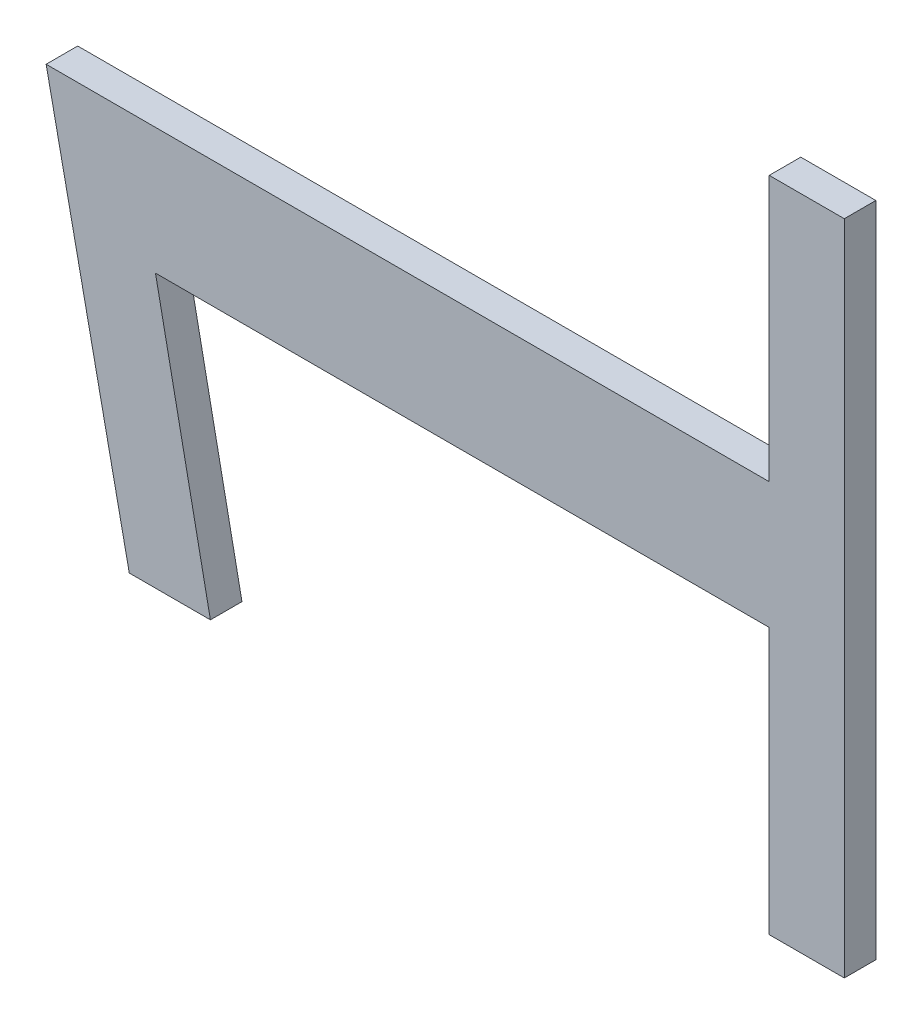
ISO-10303-21;
HEADER;
FILE_DESCRIPTION(('STEP AP214'),'2;1');
FILE_NAME('part.step','',(''),(''),'','','');
FILE_SCHEMA(('AUTOMOTIVE_DESIGN { 1 0 10303 214 1 1 1 1 }'));
ENDSEC;
DATA;
#1=APPLICATION_CONTEXT('core data for automotive mechanical design processes');
#2=APPLICATION_PROTOCOL_DEFINITION('international standard','automotive_design',2000,#1);
#3=PRODUCT_CONTEXT('',#1,'mechanical');
#4=PRODUCT('Part','Part','',(#3));
#5=PRODUCT_RELATED_PRODUCT_CATEGORY('part','',(#4));
#6=PRODUCT_DEFINITION_FORMATION('','',#4);
#7=PRODUCT_DEFINITION_CONTEXT('part definition',#1,'design');
#8=PRODUCT_DEFINITION('design','',#6,#7);
#9=PRODUCT_DEFINITION_SHAPE('','',#8);
#10=(LENGTH_UNIT() NAMED_UNIT(*) SI_UNIT(.MILLI.,.METRE.));
#11=(NAMED_UNIT(*) PLANE_ANGLE_UNIT() SI_UNIT($,.RADIAN.));
#12=(NAMED_UNIT(*) SI_UNIT($,.STERADIAN.) SOLID_ANGLE_UNIT());
#13=UNCERTAINTY_MEASURE_WITH_UNIT(LENGTH_MEASURE(1.E-05),#10,'distance_accuracy_value','');
#14=(GEOMETRIC_REPRESENTATION_CONTEXT(3) GLOBAL_UNCERTAINTY_ASSIGNED_CONTEXT((#13)) GLOBAL_UNIT_ASSIGNED_CONTEXT((#10,
#11,#12)) REPRESENTATION_CONTEXT('',''));
#15=CARTESIAN_POINT('',(0.,0.,0.));
#16=DIRECTION('',(0.,0.,1.));
#17=DIRECTION('',(1.,0.,0.));
#18=AXIS2_PLACEMENT_3D('',#15,#16,#17);
#19=CARTESIAN_POINT('',(-8.95983005625009,-22.7704584365744,333.160489148867));
#20=DIRECTION('',(0.,0.,1.));
#21=DIRECTION('',(1.,0.,0.));
#22=AXIS2_PLACEMENT_3D('',#19,#20,#21);
#23=PLANE('',#22);
#24=DIRECTION('',(0.,-1.,0.));
#25=VECTOR('',#24,1.);
#26=CARTESIAN_POINT('',(-6.41452319026449,-50.9500000001419,333.160489148867));
#27=LINE('',#26,#25);
#28=CARTESIAN_POINT('',(-6.41452319026449,38.8358930212972,333.160489148867));
#29=VERTEX_POINT('',#28);
#30=CARTESIAN_POINT('',(-6.41452319026449,32.5863625224991,333.160489148867));
#31=VERTEX_POINT('',#30);
#32=EDGE_CURVE('E11',#29,#31,#27,.T.);
#33=ORIENTED_EDGE('',*,*,#32,.T.);
#34=DIRECTION('',(-1.,0.,0.));
#35=VECTOR('',#34,1.);
#36=CARTESIAN_POINT('',(2.66453525910038E-13,32.5863625224991,333.160489148867));
#37=LINE('',#36,#35);
#38=CARTESIAN_POINT('',(-7.12807111694718,32.5863625224991,333.160489148867));
#39=VERTEX_POINT('',#38);
#40=EDGE_CURVE('E246',#31,#39,#37,.T.);
#41=ORIENTED_EDGE('',*,*,#40,.T.);
#42=DIRECTION('',(0.,1.,0.));
#43=VECTOR('',#42,1.);
#44=CARTESIAN_POINT('',(-7.12807111694718,-50.9500000001419,333.160489148867));
#45=LINE('',#44,#43);
#46=CARTESIAN_POINT('',(-7.12807111694718,35.114908125426,333.160489148867));
#47=VERTEX_POINT('',#46);
#48=EDGE_CURVE('E172',#39,#47,#45,.T.);
#49=ORIENTED_EDGE('',*,*,#48,.T.);
#50=DIRECTION('',(-1.,0.,0.));
#51=VECTOR('',#50,1.);
#52=CARTESIAN_POINT('',(2.66453525910038E-13,35.114908125426,333.160489148867));
#53=LINE('',#52,#51);
#54=CARTESIAN_POINT('',(-12.9609662491587,35.114908125426,333.160489148867));
#55=VERTEX_POINT('',#54);
#56=EDGE_CURVE('E145',#47,#55,#53,.T.);
#57=ORIENTED_EDGE('',*,*,#56,.T.);
#58=DIRECTION('',(0.197334533034253,-0.98033620869177,0.));
#59=VECTOR('',#58,1.);
#60=CARTESIAN_POINT('',(4.1933625869925,-50.1059066772484,333.160489148867));
#61=LINE('',#60,#59);
#62=CARTESIAN_POINT('',(-12.4389748128606,32.5217122069943,333.160489148867));
#63=VERTEX_POINT('',#62);
#64=EDGE_CURVE('E154',#55,#63,#61,.T.);
#65=ORIENTED_EDGE('',*,*,#64,.T.);
#66=DIRECTION('',(-1.,0.,0.));
#67=VECTOR('',#66,1.);
#68=CARTESIAN_POINT('',(2.66453525910038E-13,32.5217122069943,333.160489148867));
#69=LINE('',#68,#67);
#70=CARTESIAN_POINT('',(-13.2099896866587,32.5217122069943,333.160489148867));
#71=VERTEX_POINT('',#70);
#72=EDGE_CURVE('E238',#63,#71,#69,.T.);
#73=ORIENTED_EDGE('',*,*,#72,.T.);
#74=DIRECTION('',(-0.203954250496693,0.978980420490794,0.));
#75=VECTOR('',#74,1.);
#76=CARTESIAN_POINT('',(4.00607524756107,-50.1154010056697,333.160489148867));
#77=LINE('',#76,#75);
#78=CARTESIAN_POINT('',(-14.0001602094953,36.3145307867598,333.160489148867));
#79=VERTEX_POINT('',#78);
#80=EDGE_CURVE('E237',#71,#79,#77,.T.);
#81=ORIENTED_EDGE('',*,*,#80,.T.);
#82=DIRECTION('',(1.,0.,0.));
#83=VECTOR('',#82,1.);
#84=CARTESIAN_POINT('',(2.66453525910038E-13,36.3145307867598,333.160489148867));
#85=LINE('',#84,#83);
#86=CARTESIAN_POINT('',(-7.12807111694718,36.3145307867598,333.160489148867));
#87=VERTEX_POINT('',#86);
#88=EDGE_CURVE('E264',#79,#87,#85,.T.);
#89=ORIENTED_EDGE('',*,*,#88,.T.);
#90=DIRECTION('',(0.,1.,0.));
#91=VECTOR('',#90,1.);
#92=CARTESIAN_POINT('',(-7.12807111694718,-50.9500000001419,333.160489148867));
#93=LINE('',#92,#91);
#94=CARTESIAN_POINT('',(-7.12807111694718,38.8358930212972,333.160489148867));
#95=VERTEX_POINT('',#94);
#96=EDGE_CURVE('E325',#87,#95,#93,.T.);
#97=ORIENTED_EDGE('',*,*,#96,.T.);
#98=DIRECTION('',(1.,0.,0.));
#99=VECTOR('',#98,1.);
#100=CARTESIAN_POINT('',(2.66453525910038E-13,38.8358930212972,333.160489148867));
#101=LINE('',#100,#99);
#102=EDGE_CURVE('E229',#95,#29,#101,.T.);
#103=ORIENTED_EDGE('',*,*,#102,.T.);
#104=EDGE_LOOP('',(#33,#41,#49,#57,#65,#73,#81,#89,#97,#103));
#105=FACE_BOUND('',#104,.T.);
#106=ADVANCED_FACE('F42',(#105),#23,.F.);
#107=CARTESIAN_POINT('',(-6.41452319026449,32.5863625224991,332.960489148867));
#108=DIRECTION('',(1.,0.,0.));
#109=DIRECTION('',(0.,1.,0.));
#110=AXIS2_PLACEMENT_3D('',#107,#108,#109);
#111=PLANE('',#110);
#112=ORIENTED_EDGE('',*,*,#32,.F.);
#113=CARTESIAN_POINT('',(-6.41452319026449,38.8358930212972,333.160489148867));
#114=CARTESIAN_POINT('',(-6.41452319026449,38.8358930212972,333.260489148867));
#115=CARTESIAN_POINT('',(-6.41452319026449,38.8358930212972,333.360489148867));
#116=CARTESIAN_POINT('',(-6.41452319026449,38.8358930212972,333.460489148867));
#117=(BOUNDED_CURVE() B_SPLINE_CURVE(3,(#113,#114,#115,#116),.UNSPECIFIED.,.F.,
.F.) B_SPLINE_CURVE_WITH_KNOTS((4,4),(0.,1.),
.UNSPECIFIED.) CURVE() GEOMETRIC_REPRESENTATION_ITEM() RATIONAL_B_SPLINE_CURVE((1.,1.,1.,1.)) REPRESENTATION_ITEM(''));
#118=CARTESIAN_POINT('',(-6.41452319026449,38.8358930212972,333.460489148867));
#119=VERTEX_POINT('',#118);
#120=EDGE_CURVE('E55',#29,#119,#117,.T.);
#121=ORIENTED_EDGE('',*,*,#120,.T.);
#122=CARTESIAN_POINT('',(-6.41452319026449,32.5863625224991,333.460489148867));
#123=CARTESIAN_POINT('',(-6.41452319026449,34.6695393554318,333.460489148867));
#124=CARTESIAN_POINT('',(-6.41452319026449,36.7527161883645,333.460489148867));
#125=CARTESIAN_POINT('',(-6.41452319026449,38.8358930212972,333.460489148867));
#126=(BOUNDED_CURVE() B_SPLINE_CURVE(3,(#122,#123,#124,#125),.UNSPECIFIED.,.F.,
.F.) B_SPLINE_CURVE_WITH_KNOTS((4,4),(0.,1.),
.UNSPECIFIED.) CURVE() GEOMETRIC_REPRESENTATION_ITEM() RATIONAL_B_SPLINE_CURVE((1.,1.,1.,1.)) REPRESENTATION_ITEM(''));
#127=CARTESIAN_POINT('',(-6.41452319026449,32.5863625224991,333.460489148867));
#128=VERTEX_POINT('',#127);
#129=EDGE_CURVE('E193',#128,#119,#126,.T.);
#130=ORIENTED_EDGE('',*,*,#129,.F.);
#131=CARTESIAN_POINT('',(-6.41452319026449,32.5863625224991,333.160489148867));
#132=CARTESIAN_POINT('',(-6.41452319026449,32.5863625224991,333.260489148867));
#133=CARTESIAN_POINT('',(-6.41452319026449,32.5863625224991,333.360489148867));
#134=CARTESIAN_POINT('',(-6.41452319026449,32.5863625224991,333.460489148867));
#135=(BOUNDED_CURVE() B_SPLINE_CURVE(3,(#131,#132,#133,#134),.UNSPECIFIED.,.F.,
.F.) B_SPLINE_CURVE_WITH_KNOTS((4,4),(0.,1.),
.UNSPECIFIED.) CURVE() GEOMETRIC_REPRESENTATION_ITEM() RATIONAL_B_SPLINE_CURVE((1.,1.,1.,1.)) REPRESENTATION_ITEM(''));
#136=EDGE_CURVE('E202',#31,#128,#135,.T.);
#137=ORIENTED_EDGE('',*,*,#136,.F.);
#138=EDGE_LOOP('',(#112,#121,#130,#137));
#139=FACE_BOUND('',#138,.T.);
#140=ADVANCED_FACE('F367',(#139),#111,.T.);
#141=CARTESIAN_POINT('',(-6.41452319026449,38.8358930212972,332.960489148867));
#142=DIRECTION('',(0.,1.,0.));
#143=DIRECTION('',(1.,0.,0.));
#144=AXIS2_PLACEMENT_3D('',#141,#142,#143);
#145=PLANE('',#144);
#146=ORIENTED_EDGE('',*,*,#102,.F.);
#147=CARTESIAN_POINT('',(-7.12807111694718,38.8358930212972,333.160489148867));
#148=CARTESIAN_POINT('',(-7.12807111694718,38.8358930212972,333.260489148867));
#149=CARTESIAN_POINT('',(-7.12807111694718,38.8358930212972,333.360489148867));
#150=CARTESIAN_POINT('',(-7.12807111694718,38.8358930212972,333.460489148867));
#151=(BOUNDED_CURVE() B_SPLINE_CURVE(3,(#147,#148,#149,#150),.UNSPECIFIED.,.F.,
.F.) B_SPLINE_CURVE_WITH_KNOTS((4,4),(0.,1.),
.UNSPECIFIED.) CURVE() GEOMETRIC_REPRESENTATION_ITEM() RATIONAL_B_SPLINE_CURVE((1.,1.,1.,1.)) REPRESENTATION_ITEM(''));
#152=CARTESIAN_POINT('',(-7.12807111694718,38.8358930212972,333.460489148867));
#153=VERTEX_POINT('',#152);
#154=EDGE_CURVE('E181',#95,#153,#151,.T.);
#155=ORIENTED_EDGE('',*,*,#154,.T.);
#156=CARTESIAN_POINT('',(-6.41452319026449,38.8358930212972,333.460489148867));
#157=CARTESIAN_POINT('',(-6.65237249915872,38.8358930212972,333.460489148867));
#158=CARTESIAN_POINT('',(-6.89022180805295,38.8358930212972,333.460489148867));
#159=CARTESIAN_POINT('',(-7.12807111694718,38.8358930212972,333.460489148867));
#160=(BOUNDED_CURVE() B_SPLINE_CURVE(3,(#156,#157,#158,#159),.UNSPECIFIED.,.F.,
.F.) B_SPLINE_CURVE_WITH_KNOTS((4,4),(0.,1.),
.UNSPECIFIED.) CURVE() GEOMETRIC_REPRESENTATION_ITEM() RATIONAL_B_SPLINE_CURVE((1.,1.,1.,1.)) REPRESENTATION_ITEM(''));
#161=EDGE_CURVE('E186',#119,#153,#160,.T.);
#162=ORIENTED_EDGE('',*,*,#161,.F.);
#163=ORIENTED_EDGE('',*,*,#120,.F.);
#164=EDGE_LOOP('',(#146,#155,#162,#163));
#165=FACE_BOUND('',#164,.T.);
#166=ADVANCED_FACE('F369',(#165),#145,.T.);
#167=CARTESIAN_POINT('',(-7.12807111694718,38.8358930212972,332.960489148867));
#168=DIRECTION('',(-1.,0.,0.));
#169=DIRECTION('',(0.,0.,1.));
#170=AXIS2_PLACEMENT_3D('',#167,#168,#169);
#171=PLANE('',#170);
#172=ORIENTED_EDGE('',*,*,#96,.F.);
#173=CARTESIAN_POINT('',(-7.12807111694718,36.3145307867598,333.160489148867));
#174=CARTESIAN_POINT('',(-7.12807111694718,36.3145307867598,333.260489148867));
#175=CARTESIAN_POINT('',(-7.12807111694718,36.3145307867598,333.360489148867));
#176=CARTESIAN_POINT('',(-7.12807111694718,36.3145307867598,333.460489148867));
#177=(BOUNDED_CURVE() B_SPLINE_CURVE(3,(#173,#174,#175,#176),.UNSPECIFIED.,.F.,
.F.) B_SPLINE_CURVE_WITH_KNOTS((4,4),(0.,1.),
.UNSPECIFIED.) CURVE() GEOMETRIC_REPRESENTATION_ITEM() RATIONAL_B_SPLINE_CURVE((1.,1.,1.,1.)) REPRESENTATION_ITEM(''));
#178=CARTESIAN_POINT('',(-7.12807111694718,36.3145307867598,333.460489148867));
#179=VERTEX_POINT('',#178);
#180=EDGE_CURVE('E268',#87,#179,#177,.T.);
#181=ORIENTED_EDGE('',*,*,#180,.T.);
#182=CARTESIAN_POINT('',(-7.12807111694718,38.8358930212972,333.460489148867));
#183=CARTESIAN_POINT('',(-7.12807111694718,37.995438943118,333.460489148867));
#184=CARTESIAN_POINT('',(-7.12807111694718,37.1549848649389,333.460489148867));
#185=CARTESIAN_POINT('',(-7.12807111694718,36.3145307867598,333.460489148867));
#186=(BOUNDED_CURVE() B_SPLINE_CURVE(3,(#182,#183,#184,#185),.UNSPECIFIED.,.F.,
.F.) B_SPLINE_CURVE_WITH_KNOTS((4,4),(0.,1.),
.UNSPECIFIED.) CURVE() GEOMETRIC_REPRESENTATION_ITEM() RATIONAL_B_SPLINE_CURVE((1.,1.,1.,1.)) REPRESENTATION_ITEM(''));
#187=EDGE_CURVE('E192',#153,#179,#186,.T.);
#188=ORIENTED_EDGE('',*,*,#187,.F.);
#189=ORIENTED_EDGE('',*,*,#154,.F.);
#190=EDGE_LOOP('',(#172,#181,#188,#189));
#191=FACE_BOUND('',#190,.T.);
#192=ADVANCED_FACE('F372',(#191),#171,.T.);
#193=CARTESIAN_POINT('',(-7.12807111694718,36.3145307867598,332.960489148867));
#194=DIRECTION('',(0.,1.,0.));
#195=DIRECTION('',(1.,0.,0.));
#196=AXIS2_PLACEMENT_3D('',#193,#194,#195);
#197=PLANE('',#196);
#198=ORIENTED_EDGE('',*,*,#88,.F.);
#199=CARTESIAN_POINT('',(-14.0001602094953,36.3145307867598,333.160489148867));
#200=CARTESIAN_POINT('',(-14.0001602094953,36.3145307867598,333.260489148867));
#201=CARTESIAN_POINT('',(-14.0001602094953,36.3145307867598,333.360489148867));
#202=CARTESIAN_POINT('',(-14.0001602094953,36.3145307867598,333.460489148867));
#203=(BOUNDED_CURVE() B_SPLINE_CURVE(3,(#199,#200,#201,#202),.UNSPECIFIED.,.F.,
.F.) B_SPLINE_CURVE_WITH_KNOTS((4,4),(0.,1.),
.UNSPECIFIED.) CURVE() GEOMETRIC_REPRESENTATION_ITEM() RATIONAL_B_SPLINE_CURVE((1.,1.,1.,1.)) REPRESENTATION_ITEM(''));
#204=CARTESIAN_POINT('',(-14.0001602094953,36.3145307867598,333.460489148867));
#205=VERTEX_POINT('',#204);
#206=EDGE_CURVE('E46',#79,#205,#203,.T.);
#207=ORIENTED_EDGE('',*,*,#206,.T.);
#208=CARTESIAN_POINT('',(-7.12807111694718,36.3145307867598,333.460489148867));
#209=CARTESIAN_POINT('',(-9.41876748112988,36.3145307867598,333.460489148867));
#210=CARTESIAN_POINT('',(-11.7094638453126,36.3145307867598,333.460489148867));
#211=CARTESIAN_POINT('',(-14.0001602094953,36.3145307867598,333.460489148867));
#212=(BOUNDED_CURVE() B_SPLINE_CURVE(3,(#208,#209,#210,#211),.UNSPECIFIED.,.F.,
.F.) B_SPLINE_CURVE_WITH_KNOTS((4,4),(0.,1.),
.UNSPECIFIED.) CURVE() GEOMETRIC_REPRESENTATION_ITEM() RATIONAL_B_SPLINE_CURVE((1.,1.,1.,1.)) REPRESENTATION_ITEM(''));
#213=EDGE_CURVE('E247',#179,#205,#212,.T.);
#214=ORIENTED_EDGE('',*,*,#213,.F.);
#215=ORIENTED_EDGE('',*,*,#180,.F.);
#216=EDGE_LOOP('',(#198,#207,#214,#215));
#217=FACE_BOUND('',#216,.T.);
#218=ADVANCED_FACE('F374',(#217),#197,.T.);
#219=CARTESIAN_POINT('',(-14.0001602094953,36.3145307867598,332.960489148867));
#220=DIRECTION('',(-0.978980420490794,-0.203954250496693,0.));
#221=DIRECTION('',(-0.203954250496693,0.978980420490794,0.));
#222=AXIS2_PLACEMENT_3D('',#219,#220,#221);
#223=PLANE('',#222);
#224=ORIENTED_EDGE('',*,*,#80,.F.);
#225=CARTESIAN_POINT('',(-13.2099896866587,32.5217122069943,333.160489148867));
#226=CARTESIAN_POINT('',(-13.2099896866587,32.5217122069943,333.260489148867));
#227=CARTESIAN_POINT('',(-13.2099896866587,32.5217122069943,333.360489148867));
#228=CARTESIAN_POINT('',(-13.2099896866587,32.5217122069943,333.460489148867));
#229=(BOUNDED_CURVE() B_SPLINE_CURVE(3,(#225,#226,#227,#228),.UNSPECIFIED.,.F.,
.F.) B_SPLINE_CURVE_WITH_KNOTS((4,4),(0.,1.),
.UNSPECIFIED.) CURVE() GEOMETRIC_REPRESENTATION_ITEM() RATIONAL_B_SPLINE_CURVE((1.,1.,1.,1.)) REPRESENTATION_ITEM(''));
#230=CARTESIAN_POINT('',(-13.2099896866587,32.5217122069943,333.460489148867));
#231=VERTEX_POINT('',#230);
#232=EDGE_CURVE('E122',#71,#231,#229,.T.);
#233=ORIENTED_EDGE('',*,*,#232,.T.);
#234=CARTESIAN_POINT('',(-14.0001602094953,36.3145307867598,333.460489148867));
#235=CARTESIAN_POINT('',(-13.7367700352164,35.050257926838,333.460489148867));
#236=CARTESIAN_POINT('',(-13.4733798609376,33.7859850669161,333.460489148867));
#237=CARTESIAN_POINT('',(-13.2099896866587,32.5217122069943,333.460489148867));
#238=(BOUNDED_CURVE() B_SPLINE_CURVE(3,(#234,#235,#236,#237),.UNSPECIFIED.,.F.,
.F.) B_SPLINE_CURVE_WITH_KNOTS((4,4),(0.,1.),
.UNSPECIFIED.) CURVE() GEOMETRIC_REPRESENTATION_ITEM() RATIONAL_B_SPLINE_CURVE((1.,1.,1.,1.)) REPRESENTATION_ITEM(''));
#239=EDGE_CURVE('E256',#205,#231,#238,.T.);
#240=ORIENTED_EDGE('',*,*,#239,.F.);
#241=ORIENTED_EDGE('',*,*,#206,.F.);
#242=EDGE_LOOP('',(#224,#233,#240,#241));
#243=FACE_BOUND('',#242,.T.);
#244=ADVANCED_FACE('F376',(#243),#223,.T.);
#245=CARTESIAN_POINT('',(-13.2099896866587,32.5217122069943,332.960489148867));
#246=DIRECTION('',(0.,-1.,0.));
#247=DIRECTION('',(0.,0.,-1.));
#248=AXIS2_PLACEMENT_3D('',#245,#246,#247);
#249=PLANE('',#248);
#250=ORIENTED_EDGE('',*,*,#72,.F.);
#251=CARTESIAN_POINT('',(-12.4389748128606,32.5217122069943,333.160489148867));
#252=CARTESIAN_POINT('',(-12.4389748128606,32.5217122069943,333.260489148867));
#253=CARTESIAN_POINT('',(-12.4389748128606,32.5217122069943,333.360489148867));
#254=CARTESIAN_POINT('',(-12.4389748128606,32.5217122069943,333.460489148867));
#255=(BOUNDED_CURVE() B_SPLINE_CURVE(3,(#251,#252,#253,#254),.UNSPECIFIED.,.F.,
.F.) B_SPLINE_CURVE_WITH_KNOTS((4,4),(0.,1.),
.UNSPECIFIED.) CURVE() GEOMETRIC_REPRESENTATION_ITEM() RATIONAL_B_SPLINE_CURVE((1.,1.,1.,1.)) REPRESENTATION_ITEM(''));
#256=CARTESIAN_POINT('',(-12.4389748128606,32.5217122069943,333.460489148867));
#257=VERTEX_POINT('',#256);
#258=EDGE_CURVE('E159',#63,#257,#255,.T.);
#259=ORIENTED_EDGE('',*,*,#258,.T.);
#260=CARTESIAN_POINT('',(-13.2099896866587,32.5217122069943,333.460489148867));
#261=CARTESIAN_POINT('',(-12.952984728726,32.5217122069943,333.460489148867));
#262=CARTESIAN_POINT('',(-12.6959797707933,32.5217122069943,333.460489148867));
#263=CARTESIAN_POINT('',(-12.4389748128606,32.5217122069943,333.460489148867));
#264=(BOUNDED_CURVE() B_SPLINE_CURVE(3,(#260,#261,#262,#263),.UNSPECIFIED.,.F.,
.F.) B_SPLINE_CURVE_WITH_KNOTS((4,4),(0.,1.),
.UNSPECIFIED.) CURVE() GEOMETRIC_REPRESENTATION_ITEM() RATIONAL_B_SPLINE_CURVE((1.,1.,1.,1.)) REPRESENTATION_ITEM(''));
#265=EDGE_CURVE('E211',#231,#257,#264,.T.);
#266=ORIENTED_EDGE('',*,*,#265,.F.);
#267=ORIENTED_EDGE('',*,*,#232,.F.);
#268=EDGE_LOOP('',(#250,#259,#266,#267));
#269=FACE_BOUND('',#268,.T.);
#270=ADVANCED_FACE('F44',(#269),#249,.T.);
#271=CARTESIAN_POINT('',(-12.4389748128606,32.5217122069943,332.960489148867));
#272=DIRECTION('',(0.98033620869177,0.197334533034253,0.));
#273=DIRECTION('',(0.,0.,-1.));
#274=AXIS2_PLACEMENT_3D('',#271,#272,#273);
#275=PLANE('',#274);
#276=ORIENTED_EDGE('',*,*,#64,.F.);
#277=CARTESIAN_POINT('',(-12.9609662491587,35.114908125426,333.160489148867));
#278=CARTESIAN_POINT('',(-12.9609662491587,35.114908125426,333.260489148867));
#279=CARTESIAN_POINT('',(-12.9609662491587,35.114908125426,333.360489148867));
#280=CARTESIAN_POINT('',(-12.9609662491587,35.114908125426,333.460489148867));
#281=(BOUNDED_CURVE() B_SPLINE_CURVE(3,(#277,#278,#279,#280),.UNSPECIFIED.,.F.,
.F.) B_SPLINE_CURVE_WITH_KNOTS((4,4),(0.,1.),
.UNSPECIFIED.) CURVE() GEOMETRIC_REPRESENTATION_ITEM() RATIONAL_B_SPLINE_CURVE((1.,1.,1.,1.)) REPRESENTATION_ITEM(''));
#282=CARTESIAN_POINT('',(-12.9609662491587,35.114908125426,333.460489148867));
#283=VERTEX_POINT('',#282);
#284=EDGE_CURVE('E157',#55,#283,#281,.T.);
#285=ORIENTED_EDGE('',*,*,#284,.T.);
#286=CARTESIAN_POINT('',(-12.4389748128606,32.5217122069943,333.460489148867));
#287=CARTESIAN_POINT('',(-12.6129719582933,33.3861108464715,333.460489148867));
#288=CARTESIAN_POINT('',(-12.786969103726,34.2505094859487,333.460489148867));
#289=CARTESIAN_POINT('',(-12.9609662491587,35.114908125426,333.460489148867));
#290=(BOUNDED_CURVE() B_SPLINE_CURVE(3,(#286,#287,#288,#289),.UNSPECIFIED.,.F.,
.F.) B_SPLINE_CURVE_WITH_KNOTS((4,4),(0.,1.),
.UNSPECIFIED.) CURVE() GEOMETRIC_REPRESENTATION_ITEM() RATIONAL_B_SPLINE_CURVE((1.,1.,1.,1.)) REPRESENTATION_ITEM(''));
#291=EDGE_CURVE('E203',#257,#283,#290,.T.);
#292=ORIENTED_EDGE('',*,*,#291,.F.);
#293=ORIENTED_EDGE('',*,*,#258,.F.);
#294=EDGE_LOOP('',(#276,#285,#292,#293));
#295=FACE_BOUND('',#294,.T.);
#296=ADVANCED_FACE('F155',(#295),#275,.T.);
#297=CARTESIAN_POINT('',(-12.9609662491587,35.114908125426,332.960489148867));
#298=DIRECTION('',(0.,-1.,0.));
#299=DIRECTION('',(0.,0.,-1.));
#300=AXIS2_PLACEMENT_3D('',#297,#298,#299);
#301=PLANE('',#300);
#302=ORIENTED_EDGE('',*,*,#56,.F.);
#303=CARTESIAN_POINT('',(-7.12807111694718,35.114908125426,333.160489148867));
#304=CARTESIAN_POINT('',(-7.12807111694718,35.114908125426,333.260489148867));
#305=CARTESIAN_POINT('',(-7.12807111694718,35.114908125426,333.360489148867));
#306=CARTESIAN_POINT('',(-7.12807111694718,35.114908125426,333.460489148867));
#307=(BOUNDED_CURVE() B_SPLINE_CURVE(3,(#303,#304,#305,#306),.UNSPECIFIED.,.F.,
.F.) B_SPLINE_CURVE_WITH_KNOTS((4,4),(0.,1.),
.UNSPECIFIED.) CURVE() GEOMETRIC_REPRESENTATION_ITEM() RATIONAL_B_SPLINE_CURVE((1.,1.,1.,1.)) REPRESENTATION_ITEM(''));
#308=CARTESIAN_POINT('',(-7.12807111694718,35.114908125426,333.460489148867));
#309=VERTEX_POINT('',#308);
#310=EDGE_CURVE('E174',#47,#309,#307,.T.);
#311=ORIENTED_EDGE('',*,*,#310,.T.);
#312=CARTESIAN_POINT('',(-12.9609662491587,35.114908125426,333.460489148867));
#313=CARTESIAN_POINT('',(-11.0166678717549,35.114908125426,333.460489148867));
#314=CARTESIAN_POINT('',(-9.07236949435103,35.114908125426,333.460489148867));
#315=CARTESIAN_POINT('',(-7.12807111694718,35.114908125426,333.460489148867));
#316=(BOUNDED_CURVE() B_SPLINE_CURVE(3,(#312,#313,#314,#315),.UNSPECIFIED.,.F.,
.F.) B_SPLINE_CURVE_WITH_KNOTS((4,4),(0.,1.),
.UNSPECIFIED.) CURVE() GEOMETRIC_REPRESENTATION_ITEM() RATIONAL_B_SPLINE_CURVE((1.,1.,1.,1.)) REPRESENTATION_ITEM(''));
#317=EDGE_CURVE('E166',#283,#309,#316,.T.);
#318=ORIENTED_EDGE('',*,*,#317,.F.);
#319=ORIENTED_EDGE('',*,*,#284,.F.);
#320=EDGE_LOOP('',(#302,#311,#318,#319));
#321=FACE_BOUND('',#320,.T.);
#322=ADVANCED_FACE('F164',(#321),#301,.T.);
#323=CARTESIAN_POINT('',(-7.12807111694718,35.114908125426,332.960489148867));
#324=DIRECTION('',(-1.,0.,0.));
#325=DIRECTION('',(0.,0.,1.));
#326=AXIS2_PLACEMENT_3D('',#323,#324,#325);
#327=PLANE('',#326);
#328=ORIENTED_EDGE('',*,*,#48,.F.);
#329=CARTESIAN_POINT('',(-7.12807111694718,32.5863625224991,333.160489148867));
#330=CARTESIAN_POINT('',(-7.12807111694718,32.5863625224991,333.260489148867));
#331=CARTESIAN_POINT('',(-7.12807111694718,32.5863625224991,333.360489148867));
#332=CARTESIAN_POINT('',(-7.12807111694718,32.5863625224991,333.460489148867));
#333=(BOUNDED_CURVE() B_SPLINE_CURVE(3,(#329,#330,#331,#332),.UNSPECIFIED.,.F.,
.F.) B_SPLINE_CURVE_WITH_KNOTS((4,4),(0.,1.),
.UNSPECIFIED.) CURVE() GEOMETRIC_REPRESENTATION_ITEM() RATIONAL_B_SPLINE_CURVE((1.,1.,1.,1.)) REPRESENTATION_ITEM(''));
#334=CARTESIAN_POINT('',(-7.12807111694718,32.5863625224991,333.460489148867));
#335=VERTEX_POINT('',#334);
#336=EDGE_CURVE('E194',#39,#335,#333,.T.);
#337=ORIENTED_EDGE('',*,*,#336,.T.);
#338=CARTESIAN_POINT('',(-7.12807111694718,35.114908125426,333.460489148867));
#339=CARTESIAN_POINT('',(-7.12807111694718,34.272059591117,333.460489148867));
#340=CARTESIAN_POINT('',(-7.12807111694718,33.4292110568081,333.460489148867));
#341=CARTESIAN_POINT('',(-7.12807111694718,32.5863625224991,333.460489148867));
#342=(BOUNDED_CURVE() B_SPLINE_CURVE(3,(#338,#339,#340,#341),.UNSPECIFIED.,.F.,
.F.) B_SPLINE_CURVE_WITH_KNOTS((4,4),(0.,1.),
.UNSPECIFIED.) CURVE() GEOMETRIC_REPRESENTATION_ITEM() RATIONAL_B_SPLINE_CURVE((1.,1.,1.,1.)) REPRESENTATION_ITEM(''));
#343=EDGE_CURVE('E212',#309,#335,#342,.T.);
#344=ORIENTED_EDGE('',*,*,#343,.F.);
#345=ORIENTED_EDGE('',*,*,#310,.F.);
#346=EDGE_LOOP('',(#328,#337,#344,#345));
#347=FACE_BOUND('',#346,.T.);
#348=ADVANCED_FACE('F393',(#347),#327,.T.);
#349=CARTESIAN_POINT('',(-7.12807111694718,32.5863625224991,332.960489148867));
#350=DIRECTION('',(0.,-1.,0.));
#351=DIRECTION('',(0.,0.,-1.));
#352=AXIS2_PLACEMENT_3D('',#349,#350,#351);
#353=PLANE('',#352);
#354=ORIENTED_EDGE('',*,*,#40,.F.);
#355=ORIENTED_EDGE('',*,*,#136,.T.);
#356=CARTESIAN_POINT('',(-7.12807111694718,32.5863625224991,333.460489148867));
#357=CARTESIAN_POINT('',(-6.89022180805295,32.5863625224991,333.460489148867));
#358=CARTESIAN_POINT('',(-6.65237249915872,32.5863625224991,333.460489148867));
#359=CARTESIAN_POINT('',(-6.41452319026449,32.5863625224991,333.460489148867));
#360=(BOUNDED_CURVE() B_SPLINE_CURVE(3,(#356,#357,#358,#359),.UNSPECIFIED.,.F.,
.F.) B_SPLINE_CURVE_WITH_KNOTS((4,4),(0.,1.),
.UNSPECIFIED.) CURVE() GEOMETRIC_REPRESENTATION_ITEM() RATIONAL_B_SPLINE_CURVE((1.,1.,1.,1.)) REPRESENTATION_ITEM(''));
#361=EDGE_CURVE('E221',#335,#128,#360,.T.);
#362=ORIENTED_EDGE('',*,*,#361,.F.);
#363=ORIENTED_EDGE('',*,*,#336,.F.);
#364=EDGE_LOOP('',(#354,#355,#362,#363));
#365=FACE_BOUND('',#364,.T.);
#366=ADVANCED_FACE('F396',(#365),#353,.T.);
#367=CARTESIAN_POINT('',(-6.41452319026449,35.7111277718981,333.460489148867));
#368=DIRECTION('',(0.,0.,-1.));
#369=DIRECTION('',(0.,-1.,0.));
#370=AXIS2_PLACEMENT_3D('',#367,#368,#369);
#371=PLANE('',#370);
#372=ORIENTED_EDGE('',*,*,#129,.T.);
#373=ORIENTED_EDGE('',*,*,#161,.T.);
#374=ORIENTED_EDGE('',*,*,#187,.T.);
#375=ORIENTED_EDGE('',*,*,#213,.T.);
#376=ORIENTED_EDGE('',*,*,#239,.T.);
#377=ORIENTED_EDGE('',*,*,#265,.T.);
#378=ORIENTED_EDGE('',*,*,#291,.T.);
#379=ORIENTED_EDGE('',*,*,#317,.T.);
#380=ORIENTED_EDGE('',*,*,#343,.T.);
#381=ORIENTED_EDGE('',*,*,#361,.T.);
#382=EDGE_LOOP('',(#372,#373,#374,#375,#376,#377,#378,#379,#380,#381));
#383=FACE_BOUND('',#382,.T.);
#384=ADVANCED_FACE('F363',(#383),#371,.F.);
#385=CLOSED_SHELL('',(#106,#140,#166,#192,#218,#244,#270,#296,#322,#348,#366,#384));
#386=MANIFOLD_SOLID_BREP('B2',#385);
#387=ADVANCED_BREP_SHAPE_REPRESENTATION('',(#18,#386),#14);
#388=SHAPE_DEFINITION_REPRESENTATION(#9,#387);
ENDSEC;
END-ISO-10303-21;
